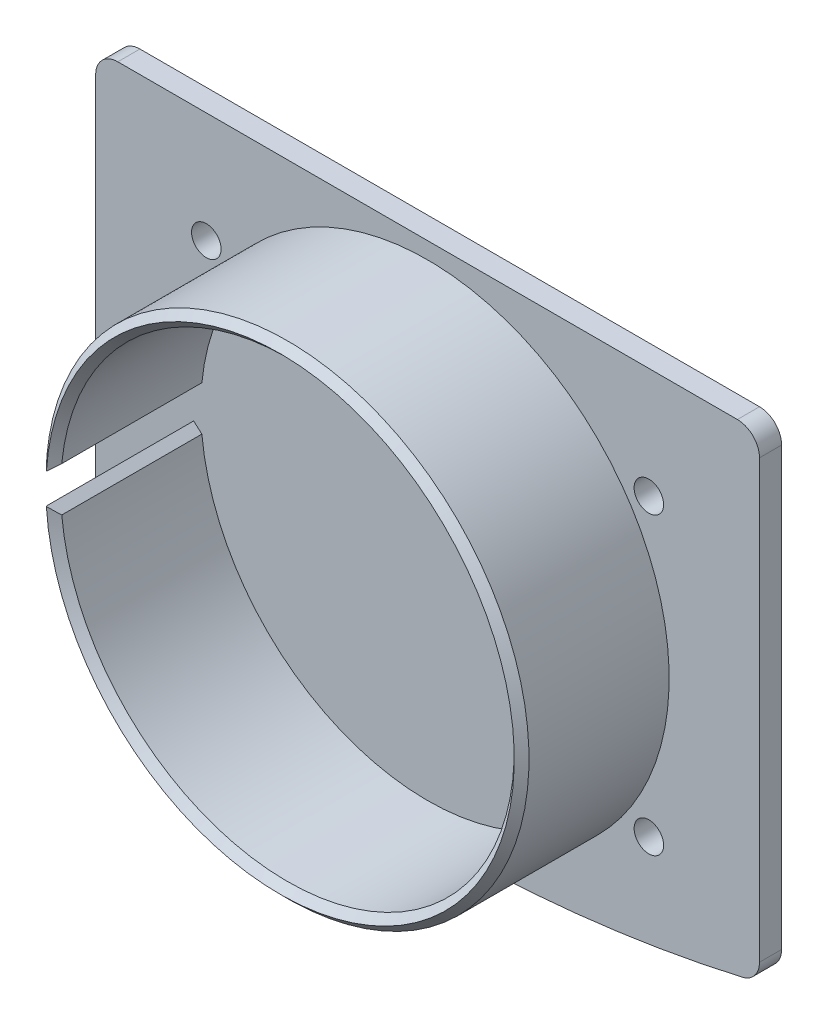
ISO-10303-21;
HEADER;
FILE_DESCRIPTION(('STEP AP214'),'2;1');
FILE_NAME('part.step','',(''),(''),'','','');
FILE_SCHEMA(('AUTOMOTIVE_DESIGN { 1 0 10303 214 1 1 1 1 }'));
ENDSEC;
DATA;
#1=APPLICATION_CONTEXT('core data for automotive mechanical design processes');
#2=APPLICATION_PROTOCOL_DEFINITION('international standard','automotive_design',2000,#1);
#3=PRODUCT_CONTEXT('',#1,'mechanical');
#4=PRODUCT('Part','Part','',(#3));
#5=PRODUCT_RELATED_PRODUCT_CATEGORY('part','',(#4));
#6=PRODUCT_DEFINITION_FORMATION('','',#4);
#7=PRODUCT_DEFINITION_CONTEXT('part definition',#1,'design');
#8=PRODUCT_DEFINITION('design','',#6,#7);
#9=PRODUCT_DEFINITION_SHAPE('','',#8);
#10=(LENGTH_UNIT() NAMED_UNIT(*) SI_UNIT(.MILLI.,.METRE.));
#11=(NAMED_UNIT(*) PLANE_ANGLE_UNIT() SI_UNIT($,.RADIAN.));
#12=(NAMED_UNIT(*) SI_UNIT($,.STERADIAN.) SOLID_ANGLE_UNIT());
#13=UNCERTAINTY_MEASURE_WITH_UNIT(LENGTH_MEASURE(1.E-05),#10,'distance_accuracy_value','');
#14=(GEOMETRIC_REPRESENTATION_CONTEXT(3) GLOBAL_UNCERTAINTY_ASSIGNED_CONTEXT((#13)) GLOBAL_UNIT_ASSIGNED_CONTEXT((#10,
#11,#12)) REPRESENTATION_CONTEXT('',''));
#15=CARTESIAN_POINT('',(0.,0.,0.));
#16=DIRECTION('',(0.,0.,1.));
#17=DIRECTION('',(1.,0.,0.));
#18=AXIS2_PLACEMENT_3D('',#15,#16,#17);
#19=CARTESIAN_POINT('',(0.,0.,3.));
#20=DIRECTION('',(0.,0.,1.));
#21=DIRECTION('',(1.,0.,0.));
#22=AXIS2_PLACEMENT_3D('',#19,#20,#21);
#23=PLANE('',#22);
#24=CARTESIAN_POINT('',(0.,0.,3.));
#25=DIRECTION('',(0.,0.,1.));
#26=DIRECTION('',(1.,0.,0.));
#27=AXIS2_PLACEMENT_3D('',#24,#25,#26);
#28=CIRCLE('',#27,30.75);
#29=CARTESIAN_POINT('',(-30.6019754080973,3.01356949848603,3.));
#30=VERTEX_POINT('',#29);
#31=CARTESIAN_POINT('',(-30.6019754080973,-3.01356949848603,3.));
#32=VERTEX_POINT('',#31);
#33=EDGE_CURVE('E187',#30,#32,#28,.F.);
#34=ORIENTED_EDGE('',*,*,#33,.F.);
#35=DIRECTION('',(-0.751600249018347,-0.659618879107897,0.));
#36=VECTOR('',#35,1.);
#37=CARTESIAN_POINT('',(-31.756883358109,2.,3.));
#38=LINE('',#37,#36);
#39=CARTESIAN_POINT('',(-31.720662435012,2.03178818091758,3.));
#40=VERTEX_POINT('',#39);
#41=EDGE_CURVE('E309',#30,#40,#38,.T.);
#42=ORIENTED_EDGE('',*,*,#41,.T.);
#43=DIRECTION('',(-0.707106781186551,0.707106781186544,0.));
#44=VECTOR('',#43,1.);
#45=CARTESIAN_POINT('',(-32.6186863764851,2.92981212239062,3.));
#46=LINE('',#45,#44);
#47=CARTESIAN_POINT('',(-32.6186863764851,2.92981212239062,3.));
#48=VERTEX_POINT('',#47);
#49=EDGE_CURVE('E304',#40,#48,#46,.T.);
#50=ORIENTED_EDGE('',*,*,#49,.T.);
#51=CARTESIAN_POINT('',(0.,0.,3.));
#52=DIRECTION('',(0.,0.,1.));
#53=DIRECTION('',(1.,0.,0.));
#54=AXIS2_PLACEMENT_3D('',#51,#52,#53);
#55=CIRCLE('',#54,32.75);
#56=CARTESIAN_POINT('',(-32.6186863764851,-2.92981212239062,3.));
#57=VERTEX_POINT('',#56);
#58=EDGE_CURVE('E178',#57,#48,#55,.T.);
#59=ORIENTED_EDGE('',*,*,#58,.F.);
#60=DIRECTION('',(-0.707106781186552,-0.707106781186543,0.));
#61=VECTOR('',#60,1.);
#62=CARTESIAN_POINT('',(-32.6186863764851,-2.92981212239062,3.));
#63=LINE('',#62,#61);
#64=CARTESIAN_POINT('',(-31.720662435012,-2.03178818091758,3.));
#65=VERTEX_POINT('',#64);
#66=EDGE_CURVE('E299',#57,#65,#63,.F.);
#67=ORIENTED_EDGE('',*,*,#66,.T.);
#68=DIRECTION('',(-0.751600249018349,0.659618879107895,0.));
#69=VECTOR('',#68,1.);
#70=CARTESIAN_POINT('',(-31.756883358109,-2.,3.));
#71=LINE('',#70,#69);
#72=EDGE_CURVE('E301',#65,#32,#71,.F.);
#73=ORIENTED_EDGE('',*,*,#72,.T.);
#74=EDGE_LOOP('',(#34,#42,#50,#59,#67,#73));
#75=FACE_BOUND('',#74,.T.);
#76=CARTESIAN_POINT('',(30.,20.,3.));
#77=DIRECTION('',(0.,0.,1.));
#78=DIRECTION('',(1.,0.,0.));
#79=AXIS2_PLACEMENT_3D('',#76,#77,#78);
#80=CIRCLE('',#79,2.);
#81=CARTESIAN_POINT('',(32.,20.,3.));
#82=VERTEX_POINT('',#81);
#83=EDGE_CURVE('E424',#82,#82,#80,.T.);
#84=ORIENTED_EDGE('',*,*,#83,.F.);
#85=EDGE_LOOP('',(#84));
#86=FACE_BOUND('',#85,.T.);
#87=CARTESIAN_POINT('',(30.,-20.,3.));
#88=DIRECTION('',(0.,0.,1.));
#89=DIRECTION('',(1.,0.,0.));
#90=AXIS2_PLACEMENT_3D('',#87,#88,#89);
#91=CIRCLE('',#90,2.);
#92=CARTESIAN_POINT('',(32.,-20.,3.));
#93=VERTEX_POINT('',#92);
#94=EDGE_CURVE('E432',#93,#93,#91,.T.);
#95=ORIENTED_EDGE('',*,*,#94,.F.);
#96=EDGE_LOOP('',(#95));
#97=FACE_BOUND('',#96,.T.);
#98=CARTESIAN_POINT('',(-30.,-20.,3.));
#99=DIRECTION('',(0.,0.,1.));
#100=DIRECTION('',(1.,0.,0.));
#101=AXIS2_PLACEMENT_3D('',#98,#99,#100);
#102=CIRCLE('',#101,2.);
#103=CARTESIAN_POINT('',(-28.,-20.,3.));
#104=VERTEX_POINT('',#103);
#105=EDGE_CURVE('E418',#104,#104,#102,.T.);
#106=ORIENTED_EDGE('',*,*,#105,.F.);
#107=EDGE_LOOP('',(#106));
#108=FACE_BOUND('',#107,.T.);
#109=CARTESIAN_POINT('',(-30.,20.,3.));
#110=DIRECTION('',(0.,0.,1.));
#111=DIRECTION('',(1.,0.,0.));
#112=AXIS2_PLACEMENT_3D('',#109,#110,#111);
#113=CIRCLE('',#112,2.);
#114=CARTESIAN_POINT('',(-28.,20.,3.));
#115=VERTEX_POINT('',#114);
#116=EDGE_CURVE('E405',#115,#115,#113,.T.);
#117=ORIENTED_EDGE('',*,*,#116,.F.);
#118=EDGE_LOOP('',(#117));
#119=FACE_BOUND('',#118,.T.);
#120=CARTESIAN_POINT('',(0.,155.,3.));
#121=DIRECTION('',(0.,0.,1.));
#122=DIRECTION('',(1.,0.,0.));
#123=AXIS2_PLACEMENT_3D('',#120,#121,#122);
#124=CIRCLE('',#123,190.);
#125=CARTESIAN_POINT('',(42.6737967914438,-30.1457454747545,3.));
#126=VERTEX_POINT('',#125);
#127=CARTESIAN_POINT('',(-42.6737967914438,-30.1457454747545,3.));
#128=VERTEX_POINT('',#127);
#129=EDGE_CURVE('E318',#126,#128,#124,.F.);
#130=ORIENTED_EDGE('',*,*,#129,.F.);
#131=CARTESIAN_POINT('',(42.,-27.2223915988374,3.));
#132=DIRECTION('',(0.,0.,1.));
#133=DIRECTION('',(1.,0.,0.));
#134=AXIS2_PLACEMENT_3D('',#131,#132,#133);
#135=CIRCLE('',#134,3.);
#136=CARTESIAN_POINT('',(45.,-27.2223915988374,3.));
#137=VERTEX_POINT('',#136);
#138=EDGE_CURVE('E57',#126,#137,#135,.T.);
#139=ORIENTED_EDGE('',*,*,#138,.T.);
#140=DIRECTION('',(0.,1.,0.));
#141=VECTOR('',#140,1.);
#142=CARTESIAN_POINT('',(45.,35.,3.));
#143=LINE('',#142,#141);
#144=CARTESIAN_POINT('',(45.,32.,3.));
#145=VERTEX_POINT('',#144);
#146=EDGE_CURVE('E370',#137,#145,#143,.T.);
#147=ORIENTED_EDGE('',*,*,#146,.T.);
#148=CARTESIAN_POINT('',(42.,32.,3.));
#149=DIRECTION('',(0.,0.,1.));
#150=DIRECTION('',(1.,0.,0.));
#151=AXIS2_PLACEMENT_3D('',#148,#149,#150);
#152=CIRCLE('',#151,3.);
#153=CARTESIAN_POINT('',(42.,35.,3.));
#154=VERTEX_POINT('',#153);
#155=EDGE_CURVE('E339',#145,#154,#152,.T.);
#156=ORIENTED_EDGE('',*,*,#155,.T.);
#157=DIRECTION('',(-1.,0.,0.));
#158=VECTOR('',#157,1.);
#159=CARTESIAN_POINT('',(-45.,35.,3.));
#160=LINE('',#159,#158);
#161=CARTESIAN_POINT('',(-42.,35.,3.));
#162=VERTEX_POINT('',#161);
#163=EDGE_CURVE('E194',#154,#162,#160,.T.);
#164=ORIENTED_EDGE('',*,*,#163,.T.);
#165=CARTESIAN_POINT('',(-42.,32.,3.));
#166=DIRECTION('',(0.,0.,1.));
#167=DIRECTION('',(1.,0.,0.));
#168=AXIS2_PLACEMENT_3D('',#165,#166,#167);
#169=CIRCLE('',#168,3.);
#170=CARTESIAN_POINT('',(-45.,32.,3.));
#171=VERTEX_POINT('',#170);
#172=EDGE_CURVE('E336',#162,#171,#169,.T.);
#173=ORIENTED_EDGE('',*,*,#172,.T.);
#174=DIRECTION('',(0.,-1.,0.));
#175=VECTOR('',#174,1.);
#176=CARTESIAN_POINT('',(-45.,35.,3.));
#177=LINE('',#176,#175);
#178=CARTESIAN_POINT('',(-45.,-27.2223915988373,3.));
#179=VERTEX_POINT('',#178);
#180=EDGE_CURVE('E380',#171,#179,#177,.T.);
#181=ORIENTED_EDGE('',*,*,#180,.T.);
#182=CARTESIAN_POINT('',(-42.,-27.2223915988373,3.));
#183=DIRECTION('',(0.,0.,1.));
#184=DIRECTION('',(1.,0.,0.));
#185=AXIS2_PLACEMENT_3D('',#182,#183,#184);
#186=CIRCLE('',#185,3.);
#187=EDGE_CURVE('E64',#179,#128,#186,.T.);
#188=ORIENTED_EDGE('',*,*,#187,.T.);
#189=EDGE_LOOP('',(#130,#139,#147,#156,#164,#173,#181,#188));
#190=FACE_BOUND('',#189,.T.);
#191=ADVANCED_FACE('F48',(#75,#86,#97,#108,#119,#190),#23,.T.);
#192=CARTESIAN_POINT('',(0.,0.,0.));
#193=DIRECTION('',(0.,0.,1.));
#194=DIRECTION('',(1.,0.,0.));
#195=AXIS2_PLACEMENT_3D('',#192,#193,#194);
#196=PLANE('',#195);
#197=CARTESIAN_POINT('',(30.,20.,0.));
#198=DIRECTION('',(0.,0.,1.));
#199=DIRECTION('',(1.,0.,0.));
#200=AXIS2_PLACEMENT_3D('',#197,#198,#199);
#201=CIRCLE('',#200,2.);
#202=CARTESIAN_POINT('',(32.,20.,0.));
#203=VERTEX_POINT('',#202);
#204=EDGE_CURVE('E420',#203,#203,#201,.T.);
#205=ORIENTED_EDGE('',*,*,#204,.T.);
#206=EDGE_LOOP('',(#205));
#207=FACE_BOUND('',#206,.T.);
#208=CARTESIAN_POINT('',(30.,-20.,0.));
#209=DIRECTION('',(0.,0.,1.));
#210=DIRECTION('',(1.,0.,0.));
#211=AXIS2_PLACEMENT_3D('',#208,#209,#210);
#212=CIRCLE('',#211,2.);
#213=CARTESIAN_POINT('',(32.,-20.,0.));
#214=VERTEX_POINT('',#213);
#215=EDGE_CURVE('E428',#214,#214,#212,.T.);
#216=ORIENTED_EDGE('',*,*,#215,.T.);
#217=EDGE_LOOP('',(#216));
#218=FACE_BOUND('',#217,.T.);
#219=CARTESIAN_POINT('',(-30.,-20.,0.));
#220=DIRECTION('',(0.,0.,1.));
#221=DIRECTION('',(1.,0.,0.));
#222=AXIS2_PLACEMENT_3D('',#219,#220,#221);
#223=CIRCLE('',#222,2.);
#224=CARTESIAN_POINT('',(-28.,-20.,0.));
#225=VERTEX_POINT('',#224);
#226=EDGE_CURVE('E436',#225,#225,#223,.T.);
#227=ORIENTED_EDGE('',*,*,#226,.T.);
#228=EDGE_LOOP('',(#227));
#229=FACE_BOUND('',#228,.T.);
#230=CARTESIAN_POINT('',(-30.,20.,0.));
#231=DIRECTION('',(0.,0.,1.));
#232=DIRECTION('',(1.,0.,0.));
#233=AXIS2_PLACEMENT_3D('',#230,#231,#232);
#234=CIRCLE('',#233,2.);
#235=CARTESIAN_POINT('',(-28.,20.,0.));
#236=VERTEX_POINT('',#235);
#237=EDGE_CURVE('E398',#236,#236,#234,.T.);
#238=ORIENTED_EDGE('',*,*,#237,.T.);
#239=EDGE_LOOP('',(#238));
#240=FACE_BOUND('',#239,.T.);
#241=DIRECTION('',(0.,1.,0.));
#242=VECTOR('',#241,1.);
#243=CARTESIAN_POINT('',(45.,35.,0.));
#244=LINE('',#243,#242);
#245=CARTESIAN_POINT('',(45.,-27.2223915988374,0.));
#246=VERTEX_POINT('',#245);
#247=CARTESIAN_POINT('',(45.,32.,0.));
#248=VERTEX_POINT('',#247);
#249=EDGE_CURVE('E387',#246,#248,#244,.T.);
#250=ORIENTED_EDGE('',*,*,#249,.F.);
#251=CARTESIAN_POINT('',(42.,-27.2223915988374,0.));
#252=DIRECTION('',(0.,0.,1.));
#253=DIRECTION('',(1.,0.,0.));
#254=AXIS2_PLACEMENT_3D('',#251,#252,#253);
#255=CIRCLE('',#254,3.);
#256=CARTESIAN_POINT('',(42.6737967914438,-30.1457454747545,0.));
#257=VERTEX_POINT('',#256);
#258=EDGE_CURVE('E357',#246,#257,#255,.F.);
#259=ORIENTED_EDGE('',*,*,#258,.T.);
#260=CARTESIAN_POINT('',(0.,155.,0.));
#261=DIRECTION('',(0.,0.,1.));
#262=DIRECTION('',(1.,0.,0.));
#263=AXIS2_PLACEMENT_3D('',#260,#261,#262);
#264=CIRCLE('',#263,190.);
#265=CARTESIAN_POINT('',(-42.6737967914438,-30.1457454747545,0.));
#266=VERTEX_POINT('',#265);
#267=EDGE_CURVE('E346',#257,#266,#264,.F.);
#268=ORIENTED_EDGE('',*,*,#267,.T.);
#269=CARTESIAN_POINT('',(-42.,-27.2223915988373,0.));
#270=DIRECTION('',(0.,0.,1.));
#271=DIRECTION('',(1.,0.,0.));
#272=AXIS2_PLACEMENT_3D('',#269,#270,#271);
#273=CIRCLE('',#272,3.);
#274=CARTESIAN_POINT('',(-45.,-27.2223915988373,0.));
#275=VERTEX_POINT('',#274);
#276=EDGE_CURVE('E354',#266,#275,#273,.F.);
#277=ORIENTED_EDGE('',*,*,#276,.T.);
#278=DIRECTION('',(0.,-1.,0.));
#279=VECTOR('',#278,1.);
#280=CARTESIAN_POINT('',(-45.,35.,0.));
#281=LINE('',#280,#279);
#282=CARTESIAN_POINT('',(-45.,32.,0.));
#283=VERTEX_POINT('',#282);
#284=EDGE_CURVE('E392',#283,#275,#281,.T.);
#285=ORIENTED_EDGE('',*,*,#284,.F.);
#286=CARTESIAN_POINT('',(-42.,32.,0.));
#287=DIRECTION('',(0.,0.,1.));
#288=DIRECTION('',(1.,0.,0.));
#289=AXIS2_PLACEMENT_3D('',#286,#287,#288);
#290=CIRCLE('',#289,3.);
#291=CARTESIAN_POINT('',(-42.,35.,0.));
#292=VERTEX_POINT('',#291);
#293=EDGE_CURVE('E325',#283,#292,#290,.F.);
#294=ORIENTED_EDGE('',*,*,#293,.T.);
#295=DIRECTION('',(-1.,0.,0.));
#296=VECTOR('',#295,1.);
#297=CARTESIAN_POINT('',(-45.,35.,0.));
#298=LINE('',#297,#296);
#299=CARTESIAN_POINT('',(42.,35.,0.));
#300=VERTEX_POINT('',#299);
#301=EDGE_CURVE('E402',#300,#292,#298,.T.);
#302=ORIENTED_EDGE('',*,*,#301,.F.);
#303=CARTESIAN_POINT('',(42.,32.,0.));
#304=DIRECTION('',(0.,0.,1.));
#305=DIRECTION('',(1.,0.,0.));
#306=AXIS2_PLACEMENT_3D('',#303,#304,#305);
#307=CIRCLE('',#306,3.);
#308=EDGE_CURVE('E328',#300,#248,#307,.F.);
#309=ORIENTED_EDGE('',*,*,#308,.T.);
#310=EDGE_LOOP('',(#250,#259,#268,#277,#285,#294,#302,#309));
#311=FACE_BOUND('',#310,.T.);
#312=ADVANCED_FACE('F385',(#207,#218,#229,#240,#311),#196,.F.);
#313=CARTESIAN_POINT('',(-45.,35.,3.));
#314=DIRECTION('',(1.,0.,0.));
#315=DIRECTION('',(0.,1.,0.));
#316=AXIS2_PLACEMENT_3D('',#313,#314,#315);
#317=PLANE('',#316);
#318=ORIENTED_EDGE('',*,*,#284,.T.);
#319=DIRECTION('',(0.,0.,-1.));
#320=VECTOR('',#319,1.);
#321=CARTESIAN_POINT('',(-45.,-27.2223915988373,3.));
#322=LINE('',#321,#320);
#323=EDGE_CURVE('E12',#275,#179,#322,.F.);
#324=ORIENTED_EDGE('',*,*,#323,.T.);
#325=ORIENTED_EDGE('',*,*,#180,.F.);
#326=DIRECTION('',(0.,0.,-1.));
#327=VECTOR('',#326,1.);
#328=CARTESIAN_POINT('',(-45.,32.,3.));
#329=LINE('',#328,#327);
#330=EDGE_CURVE('E342',#171,#283,#329,.T.);
#331=ORIENTED_EDGE('',*,*,#330,.T.);
#332=EDGE_LOOP('',(#318,#324,#325,#331));
#333=FACE_BOUND('',#332,.T.);
#334=ADVANCED_FACE('F394',(#333),#317,.F.);
#335=CARTESIAN_POINT('',(45.,35.,3.));
#336=DIRECTION('',(-1.,0.,0.));
#337=DIRECTION('',(0.,-1.,0.));
#338=AXIS2_PLACEMENT_3D('',#335,#336,#337);
#339=PLANE('',#338);
#340=ORIENTED_EDGE('',*,*,#146,.F.);
#341=DIRECTION('',(0.,0.,-1.));
#342=VECTOR('',#341,1.);
#343=CARTESIAN_POINT('',(45.,-27.2223915988374,3.));
#344=LINE('',#343,#342);
#345=EDGE_CURVE('E350',#137,#246,#344,.T.);
#346=ORIENTED_EDGE('',*,*,#345,.T.);
#347=ORIENTED_EDGE('',*,*,#249,.T.);
#348=DIRECTION('',(0.,0.,-1.));
#349=VECTOR('',#348,1.);
#350=CARTESIAN_POINT('',(45.,32.,3.));
#351=LINE('',#350,#349);
#352=EDGE_CURVE('E332',#248,#145,#351,.F.);
#353=ORIENTED_EDGE('',*,*,#352,.T.);
#354=EDGE_LOOP('',(#340,#346,#347,#353));
#355=FACE_BOUND('',#354,.T.);
#356=ADVANCED_FACE('F375',(#355),#339,.F.);
#357=CARTESIAN_POINT('',(-45.,35.,3.));
#358=DIRECTION('',(0.,-1.,0.));
#359=DIRECTION('',(0.,0.,-1.));
#360=AXIS2_PLACEMENT_3D('',#357,#358,#359);
#361=PLANE('',#360);
#362=ORIENTED_EDGE('',*,*,#163,.F.);
#363=DIRECTION('',(0.,0.,-1.));
#364=VECTOR('',#363,1.);
#365=CARTESIAN_POINT('',(42.,35.,3.));
#366=LINE('',#365,#364);
#367=EDGE_CURVE('E321',#154,#300,#366,.T.);
#368=ORIENTED_EDGE('',*,*,#367,.T.);
#369=ORIENTED_EDGE('',*,*,#301,.T.);
#370=DIRECTION('',(0.,0.,-1.));
#371=VECTOR('',#370,1.);
#372=CARTESIAN_POINT('',(-42.,35.,3.));
#373=LINE('',#372,#371);
#374=EDGE_CURVE('E312',#292,#162,#373,.F.);
#375=ORIENTED_EDGE('',*,*,#374,.T.);
#376=EDGE_LOOP('',(#362,#368,#369,#375));
#377=FACE_BOUND('',#376,.T.);
#378=ADVANCED_FACE('F457',(#377),#361,.F.);
#379=CARTESIAN_POINT('',(-30.,20.,0.));
#380=DIRECTION('',(0.,0.,1.));
#381=DIRECTION('',(1.,0.,0.));
#382=AXIS2_PLACEMENT_3D('',#379,#380,#381);
#383=CYLINDRICAL_SURFACE('',#382,2.);
#384=ORIENTED_EDGE('',*,*,#237,.F.);
#385=EDGE_LOOP('',(#384));
#386=FACE_BOUND('',#385,.T.);
#387=ORIENTED_EDGE('',*,*,#116,.T.);
#388=EDGE_LOOP('',(#387));
#389=FACE_BOUND('',#388,.T.);
#390=ADVANCED_FACE('F455',(#386,#389),#383,.F.);
#391=CARTESIAN_POINT('',(-30.,-20.,0.));
#392=DIRECTION('',(0.,0.,1.));
#393=DIRECTION('',(1.,0.,0.));
#394=AXIS2_PLACEMENT_3D('',#391,#392,#393);
#395=CYLINDRICAL_SURFACE('',#394,2.);
#396=ORIENTED_EDGE('',*,*,#226,.F.);
#397=EDGE_LOOP('',(#396));
#398=FACE_BOUND('',#397,.T.);
#399=ORIENTED_EDGE('',*,*,#105,.T.);
#400=EDGE_LOOP('',(#399));
#401=FACE_BOUND('',#400,.T.);
#402=ADVANCED_FACE('F448',(#398,#401),#395,.F.);
#403=CARTESIAN_POINT('',(30.,-20.,0.));
#404=DIRECTION('',(0.,0.,1.));
#405=DIRECTION('',(1.,0.,0.));
#406=AXIS2_PLACEMENT_3D('',#403,#404,#405);
#407=CYLINDRICAL_SURFACE('',#406,2.);
#408=ORIENTED_EDGE('',*,*,#215,.F.);
#409=EDGE_LOOP('',(#408));
#410=FACE_BOUND('',#409,.T.);
#411=ORIENTED_EDGE('',*,*,#94,.T.);
#412=EDGE_LOOP('',(#411));
#413=FACE_BOUND('',#412,.T.);
#414=ADVANCED_FACE('F463',(#410,#413),#407,.F.);
#415=CARTESIAN_POINT('',(30.,20.,0.));
#416=DIRECTION('',(0.,0.,1.));
#417=DIRECTION('',(1.,0.,0.));
#418=AXIS2_PLACEMENT_3D('',#415,#416,#417);
#419=CYLINDRICAL_SURFACE('',#418,2.);
#420=ORIENTED_EDGE('',*,*,#204,.F.);
#421=EDGE_LOOP('',(#420));
#422=FACE_BOUND('',#421,.T.);
#423=ORIENTED_EDGE('',*,*,#83,.T.);
#424=EDGE_LOOP('',(#423));
#425=FACE_BOUND('',#424,.T.);
#426=ADVANCED_FACE('F470',(#422,#425),#419,.F.);
#427=CARTESIAN_POINT('',(0.,0.,23.));
#428=DIRECTION('',(0.,0.,-1.));
#429=DIRECTION('',(-1.,0.,0.));
#430=AXIS2_PLACEMENT_3D('',#427,#428,#429);
#431=CYLINDRICAL_SURFACE('',#430,32.75);
#432=CARTESIAN_POINT('',(0.,0.,22.));
#433=DIRECTION('',(0.,0.,1.));
#434=DIRECTION('',(1.,0.,0.));
#435=AXIS2_PLACEMENT_3D('',#432,#433,#434);
#436=CIRCLE('',#435,32.75);
#437=CARTESIAN_POINT('',(-32.6186863764851,2.92981212239062,22.));
#438=VERTEX_POINT('',#437);
#439=CARTESIAN_POINT('',(-32.6186863764851,-2.92981212239062,22.));
#440=VERTEX_POINT('',#439);
#441=EDGE_CURVE('E175',#438,#440,#436,.F.);
#442=ORIENTED_EDGE('',*,*,#441,.T.);
#443=DIRECTION('',(0.,0.,-1.));
#444=VECTOR('',#443,1.);
#445=CARTESIAN_POINT('',(-32.6186863764851,-2.92981212239062,23.));
#446=LINE('',#445,#444);
#447=EDGE_CURVE('E180',#440,#57,#446,.T.);
#448=ORIENTED_EDGE('',*,*,#447,.T.);
#449=ORIENTED_EDGE('',*,*,#58,.T.);
#450=DIRECTION('',(0.,0.,-1.));
#451=VECTOR('',#450,1.);
#452=CARTESIAN_POINT('',(-32.6186863764851,2.92981212239062,23.));
#453=LINE('',#452,#451);
#454=EDGE_CURVE('E160',#48,#438,#453,.F.);
#455=ORIENTED_EDGE('',*,*,#454,.T.);
#456=EDGE_LOOP('',(#442,#448,#449,#455));
#457=FACE_BOUND('',#456,.T.);
#458=ADVANCED_FACE('F173',(#457),#431,.T.);
#459=CARTESIAN_POINT('',(0.,0.,23.));
#460=DIRECTION('',(0.,0.,-1.));
#461=DIRECTION('',(-1.,0.,0.));
#462=AXIS2_PLACEMENT_3D('',#459,#460,#461);
#463=CYLINDRICAL_SURFACE('',#462,30.75);
#464=ORIENTED_EDGE('',*,*,#33,.T.);
#465=DIRECTION('',(0.,0.,-1.));
#466=VECTOR('',#465,1.);
#467=CARTESIAN_POINT('',(-30.6019754080974,-3.01356949848603,23.));
#468=LINE('',#467,#466);
#469=CARTESIAN_POINT('',(-30.6019754080973,-3.01356949848603,22.));
#470=VERTEX_POINT('',#469);
#471=EDGE_CURVE('E248',#32,#470,#468,.F.);
#472=ORIENTED_EDGE('',*,*,#471,.T.);
#473=CARTESIAN_POINT('',(0.,0.,22.));
#474=DIRECTION('',(0.,0.,1.));
#475=DIRECTION('',(1.,0.,0.));
#476=AXIS2_PLACEMENT_3D('',#473,#474,#475);
#477=CIRCLE('',#476,30.75);
#478=CARTESIAN_POINT('',(-30.6019754080973,3.01356949848603,22.));
#479=VERTEX_POINT('',#478);
#480=EDGE_CURVE('E181',#470,#479,#477,.T.);
#481=ORIENTED_EDGE('',*,*,#480,.T.);
#482=DIRECTION('',(0.,0.,-1.));
#483=VECTOR('',#482,1.);
#484=CARTESIAN_POINT('',(-30.6019754080974,3.01356949848603,23.));
#485=LINE('',#484,#483);
#486=EDGE_CURVE('E279',#479,#30,#485,.T.);
#487=ORIENTED_EDGE('',*,*,#486,.T.);
#488=EDGE_LOOP('',(#464,#472,#481,#487));
#489=FACE_BOUND('',#488,.T.);
#490=ADVANCED_FACE('F262',(#489),#463,.F.);
#491=CARTESIAN_POINT('',(0.,0.,22.));
#492=DIRECTION('',(0.,0.,1.));
#493=DIRECTION('',(1.,0.,0.));
#494=AXIS2_PLACEMENT_3D('',#491,#492,#493);
#495=CONICAL_SURFACE('',#494,30.75,0.785398163397459);
#496=ORIENTED_EDGE('',*,*,#480,.F.);
#497=CARTESIAN_POINT('',(-30.6019754080973,-3.01356949848603,22.));
#498=CARTESIAN_POINT('',(-30.6925532040343,-2.9340766772609,22.0823514553551));
#499=CARTESIAN_POINT('',(-30.7829988409855,-2.85469984131134,22.164960079331));
#500=CARTESIAN_POINT('',(-30.9636311557315,-2.69617343696403,22.3306729128602));
#501=CARTESIAN_POINT('',(-31.0538178376559,-2.61702386494205,22.4137771144446));
#502=CARTESIAN_POINT('',(-31.2339404363061,-2.45894479727431,22.5804649295655));
#503=CARTESIAN_POINT('',(-31.3238763532256,-2.38001530145858,22.6640485427316));
#504=CARTESIAN_POINT('',(-31.5035054663671,-2.22236932619406,22.8316802852238));
#505=CARTESIAN_POINT('',(-31.5931986586736,-2.14365285018167,22.9157284219778));
#506=CARTESIAN_POINT('',(-31.682773033814,-2.06504065040646,23.));
#507=B_SPLINE_CURVE_WITH_KNOTS('',3,(#497,#498,#499,#500,#501,#502,#503,#504,#505,#506),
.UNSPECIFIED.,.F.,.F.,(4,2,2,2,4),(0.,0.437888653288207,0.875770284243997,1.31365157691814,
1.75153989181219),.UNSPECIFIED.);
#508=CARTESIAN_POINT('',(-31.682773033814,-2.06504065040646,23.));
#509=VERTEX_POINT('',#508);
#510=EDGE_CURVE('E247',#470,#509,#507,.T.);
#511=ORIENTED_EDGE('',*,*,#510,.T.);
#512=CARTESIAN_POINT('',(0.,0.,23.));
#513=DIRECTION('',(0.,0.,1.));
#514=DIRECTION('',(1.,0.,0.));
#515=AXIS2_PLACEMENT_3D('',#512,#513,#514);
#516=CIRCLE('',#515,31.75);
#517=CARTESIAN_POINT('',(-31.682773033814,2.06504065040646,23.));
#518=VERTEX_POINT('',#517);
#519=EDGE_CURVE('E198',#518,#509,#516,.F.);
#520=ORIENTED_EDGE('',*,*,#519,.F.);
#521=CARTESIAN_POINT('',(-31.682773033814,2.06504065040646,23.));
#522=CARTESIAN_POINT('',(-31.5931986586736,2.14365285018166,22.9157284219778));
#523=CARTESIAN_POINT('',(-31.5035054663672,2.22236932619406,22.8316802852238));
#524=CARTESIAN_POINT('',(-31.3238763532256,2.38001530145858,22.6640485427316));
#525=CARTESIAN_POINT('',(-31.2339404363061,2.4589447972743,22.5804649295655));
#526=CARTESIAN_POINT('',(-31.0538178376559,2.61702386494204,22.4137771144446));
#527=CARTESIAN_POINT('',(-30.9636311557315,2.69617343696403,22.3306729128602));
#528=CARTESIAN_POINT('',(-30.7829988409855,2.85469984131134,22.164960079331));
#529=CARTESIAN_POINT('',(-30.6925532040343,2.9340766772609,22.0823514553551));
#530=CARTESIAN_POINT('',(-30.6019754080973,3.01356949848603,22.));
#531=B_SPLINE_CURVE_WITH_KNOTS('',3,(#521,#522,#523,#524,#525,#526,#527,#528,#529,#530),
.UNSPECIFIED.,.F.,.F.,(4,2,2,2,4),(0.,0.437888314894043,0.875769607568188,1.31365123852398,
1.75153989181219),.UNSPECIFIED.);
#532=EDGE_CURVE('E239',#518,#479,#531,.T.);
#533=ORIENTED_EDGE('',*,*,#532,.T.);
#534=EDGE_LOOP('',(#496,#511,#520,#533));
#535=FACE_BOUND('',#534,.T.);
#536=ADVANCED_FACE('F256',(#535),#495,.F.);
#537=CARTESIAN_POINT('',(0.,0.,23.));
#538=DIRECTION('',(0.,0.,-1.));
#539=DIRECTION('',(-1.,0.,0.));
#540=AXIS2_PLACEMENT_3D('',#537,#538,#539);
#541=CONICAL_SURFACE('',#540,31.75,0.785398163397445);
#542=CARTESIAN_POINT('',(-31.682773033814,-2.06504065040646,23.));
#543=CARTESIAN_POINT('',(-31.6951292620471,-2.05419658612131,22.9883752210266));
#544=CARTESIAN_POINT('',(-31.707483236522,-2.0433544997778,22.9767462060153));
#545=CARTESIAN_POINT('',(-31.7321866779536,-2.02167428297564,22.9534797039184));
#546=CARTESIAN_POINT('',(-31.7445361449104,-2.010836152517,22.9418422168328));
#547=CARTESIAN_POINT('',(-31.756883358109,-2.,22.9302004937092));
#548=B_SPLINE_CURVE_WITH_KNOTS('',3,(#542,#543,#544,#545,#546,#547),.UNSPECIFIED.,.F.,.F.,(4,2,
4),(0.,0.0604040528910476,0.120808105773281),.UNSPECIFIED.);
#549=CARTESIAN_POINT('',(-31.720662435012,-2.03178818091758,22.9643335994336));
#550=VERTEX_POINT('',#549);
#551=EDGE_CURVE('E167',#509,#550,#548,.T.);
#552=ORIENTED_EDGE('',*,*,#551,.T.);
#553=CARTESIAN_POINT('',(-31.6888742540945,-2.,22.9980748380227));
#554=CARTESIAN_POINT('',(-31.8444878759371,-2.15561362184266,22.8329306284773));
#555=CARTESIAN_POINT('',(-31.9997790393649,-2.31090478527048,22.6671856107931));
#556=CARTESIAN_POINT('',(-32.3097164133451,-2.62084215925068,22.3344939978394));
#557=CARTESIAN_POINT('',(-32.4643626240475,-2.77548836995306,22.1675474028493));
#558=CARTESIAN_POINT('',(-32.6186863764851,-2.92981212239062,22.));
#559=B_SPLINE_CURVE_WITH_KNOTS('',3,(#553,#554,#555,#556,#557,#558),.UNSPECIFIED.,.F.,.F.,(4,2,
4),(0.,0.825420447942653,1.65084070389228),.UNSPECIFIED.);
#560=EDGE_CURVE('E185',#550,#440,#559,.T.);
#561=ORIENTED_EDGE('',*,*,#560,.T.);
#562=ORIENTED_EDGE('',*,*,#441,.F.);
#563=CARTESIAN_POINT('',(-32.6186863764851,2.92981212239062,22.));
#564=CARTESIAN_POINT('',(-32.4643626240475,2.77548836995307,22.1675474028493));
#565=CARTESIAN_POINT('',(-32.3097164133451,2.62084215925068,22.3344939978394));
#566=CARTESIAN_POINT('',(-31.9997790393649,2.31090478527048,22.6671856107931));
#567=CARTESIAN_POINT('',(-31.8444878759371,2.15561362184266,22.8329306284773));
#568=CARTESIAN_POINT('',(-31.6888742540945,2.,22.9980748380227));
#569=B_SPLINE_CURVE_WITH_KNOTS('',3,(#563,#564,#565,#566,#567,#568),.UNSPECIFIED.,.F.,.F.,(4,2,
4),(0.,0.825420255949621,1.65084070389228),.UNSPECIFIED.);
#570=CARTESIAN_POINT('',(-31.7206624349979,2.03178818092999,22.9643335994469));
#571=VERTEX_POINT('',#570);
#572=EDGE_CURVE('E156',#438,#571,#569,.T.);
#573=ORIENTED_EDGE('',*,*,#572,.T.);
#574=CARTESIAN_POINT('',(-31.756883358109,2.,22.9302004937164));
#575=CARTESIAN_POINT('',(-31.7445361449096,2.01083615251774,22.9418422168372));
#576=CARTESIAN_POINT('',(-31.7321866779524,2.02167428297675,22.9534797039208));
#577=CARTESIAN_POINT('',(-31.7074832365207,2.0433544997789,22.9767462060153));
#578=CARTESIAN_POINT('',(-31.6951292620462,2.05419658612205,22.9883752210262));
#579=CARTESIAN_POINT('',(-31.682773033814,2.06504065040646,23.));
#580=B_SPLINE_CURVE_WITH_KNOTS('',3,(#574,#575,#576,#577,#578,#579),.UNSPECIFIED.,.F.,.F.,(4,2,
4),(0.,0.0604040528801658,0.12080810576914),.UNSPECIFIED.);
#581=EDGE_CURVE('E168',#571,#518,#580,.T.);
#582=ORIENTED_EDGE('',*,*,#581,.T.);
#583=ORIENTED_EDGE('',*,*,#519,.T.);
#584=EDGE_LOOP('',(#552,#561,#562,#573,#582,#583));
#585=FACE_BOUND('',#584,.T.);
#586=ADVANCED_FACE('F183',(#585),#541,.T.);
#587=CARTESIAN_POINT('',(-31.756883358109,-2.,23.));
#588=DIRECTION('',(-0.659618879107895,-0.751600249018349,0.));
#589=DIRECTION('',(0.,0.,-1.));
#590=AXIS2_PLACEMENT_3D('',#587,#588,#589);
#591=PLANE('',#590);
#592=DIRECTION('',(0.,0.,1.));
#593=VECTOR('',#592,1.);
#594=CARTESIAN_POINT('',(-31.720662435012,-2.03178818091758,23.));
#595=LINE('',#594,#593);
#596=EDGE_CURVE('E201',#550,#65,#595,.F.);
#597=ORIENTED_EDGE('',*,*,#596,.F.);
#598=ORIENTED_EDGE('',*,*,#551,.F.);
#599=ORIENTED_EDGE('',*,*,#510,.F.);
#600=ORIENTED_EDGE('',*,*,#471,.F.);
#601=ORIENTED_EDGE('',*,*,#72,.F.);
#602=EDGE_LOOP('',(#597,#598,#599,#600,#601));
#603=FACE_BOUND('',#602,.T.);
#604=ADVANCED_FACE('F270',(#603),#591,.F.);
#605=CARTESIAN_POINT('',(-32.6186863764851,-2.92981212239062,23.));
#606=DIRECTION('',(0.707106781186543,-0.707106781186552,0.));
#607=DIRECTION('',(0.,0.,-1.));
#608=AXIS2_PLACEMENT_3D('',#605,#606,#607);
#609=PLANE('',#608);
#610=ORIENTED_EDGE('',*,*,#560,.F.);
#611=ORIENTED_EDGE('',*,*,#596,.T.);
#612=ORIENTED_EDGE('',*,*,#66,.F.);
#613=ORIENTED_EDGE('',*,*,#447,.F.);
#614=EDGE_LOOP('',(#610,#611,#612,#613));
#615=FACE_BOUND('',#614,.T.);
#616=ADVANCED_FACE('F231',(#615),#609,.F.);
#617=CARTESIAN_POINT('',(-31.756883358109,2.,23.));
#618=DIRECTION('',(0.659618879107897,-0.751600249018347,0.));
#619=DIRECTION('',(0.,0.,-1.));
#620=AXIS2_PLACEMENT_3D('',#617,#618,#619);
#621=PLANE('',#620);
#622=DIRECTION('',(0.,0.,-1.));
#623=VECTOR('',#622,1.);
#624=CARTESIAN_POINT('',(-31.720662435012,2.03178818091758,23.));
#625=LINE('',#624,#623);
#626=EDGE_CURVE('E162',#40,#571,#625,.F.);
#627=ORIENTED_EDGE('',*,*,#626,.F.);
#628=ORIENTED_EDGE('',*,*,#41,.F.);
#629=ORIENTED_EDGE('',*,*,#486,.F.);
#630=ORIENTED_EDGE('',*,*,#532,.F.);
#631=ORIENTED_EDGE('',*,*,#581,.F.);
#632=EDGE_LOOP('',(#627,#628,#629,#630,#631));
#633=FACE_BOUND('',#632,.T.);
#634=ADVANCED_FACE('F223',(#633),#621,.T.);
#635=CARTESIAN_POINT('',(-32.6186863764851,2.92981212239062,23.));
#636=DIRECTION('',(-0.707106781186544,-0.707106781186551,0.));
#637=DIRECTION('',(0.,0.,-1.));
#638=AXIS2_PLACEMENT_3D('',#635,#636,#637);
#639=PLANE('',#638);
#640=ORIENTED_EDGE('',*,*,#49,.F.);
#641=ORIENTED_EDGE('',*,*,#626,.T.);
#642=ORIENTED_EDGE('',*,*,#572,.F.);
#643=ORIENTED_EDGE('',*,*,#454,.F.);
#644=EDGE_LOOP('',(#640,#641,#642,#643));
#645=FACE_BOUND('',#644,.T.);
#646=ADVANCED_FACE('F159',(#645),#639,.T.);
#647=CARTESIAN_POINT('',(42.,32.,3.));
#648=DIRECTION('',(0.,0.,-1.));
#649=DIRECTION('',(-1.,0.,0.));
#650=AXIS2_PLACEMENT_3D('',#647,#648,#649);
#651=CYLINDRICAL_SURFACE('',#650,3.);
#652=ORIENTED_EDGE('',*,*,#155,.F.);
#653=ORIENTED_EDGE('',*,*,#352,.F.);
#654=ORIENTED_EDGE('',*,*,#308,.F.);
#655=ORIENTED_EDGE('',*,*,#367,.F.);
#656=EDGE_LOOP('',(#652,#653,#654,#655));
#657=FACE_BOUND('',#656,.T.);
#658=ADVANCED_FACE('F235',(#657),#651,.T.);
#659=CARTESIAN_POINT('',(-42.,32.,3.));
#660=DIRECTION('',(0.,0.,-1.));
#661=DIRECTION('',(-1.,0.,0.));
#662=AXIS2_PLACEMENT_3D('',#659,#660,#661);
#663=CYLINDRICAL_SURFACE('',#662,3.);
#664=ORIENTED_EDGE('',*,*,#172,.F.);
#665=ORIENTED_EDGE('',*,*,#374,.F.);
#666=ORIENTED_EDGE('',*,*,#293,.F.);
#667=ORIENTED_EDGE('',*,*,#330,.F.);
#668=EDGE_LOOP('',(#664,#665,#666,#667));
#669=FACE_BOUND('',#668,.T.);
#670=ADVANCED_FACE('F495',(#669),#663,.T.);
#671=CARTESIAN_POINT('',(0.,155.,23.));
#672=DIRECTION('',(0.,0.,-1.));
#673=DIRECTION('',(-1.,0.,0.));
#674=AXIS2_PLACEMENT_3D('',#671,#672,#673);
#675=CYLINDRICAL_SURFACE('',#674,190.);
#676=ORIENTED_EDGE('',*,*,#267,.F.);
#677=DIRECTION('',(0.,0.,-1.));
#678=VECTOR('',#677,1.);
#679=CARTESIAN_POINT('',(42.6737967914438,-30.1457454747545,23.));
#680=LINE('',#679,#678);
#681=EDGE_CURVE('E363',#257,#126,#680,.F.);
#682=ORIENTED_EDGE('',*,*,#681,.T.);
#683=ORIENTED_EDGE('',*,*,#129,.T.);
#684=DIRECTION('',(0.,0.,-1.));
#685=VECTOR('',#684,1.);
#686=CARTESIAN_POINT('',(-42.6737967914438,-30.1457454747545,23.));
#687=LINE('',#686,#685);
#688=EDGE_CURVE('E360',#128,#266,#687,.T.);
#689=ORIENTED_EDGE('',*,*,#688,.T.);
#690=EDGE_LOOP('',(#676,#682,#683,#689));
#691=FACE_BOUND('',#690,.T.);
#692=ADVANCED_FACE('F389',(#691),#675,.T.);
#693=CARTESIAN_POINT('',(42.,-27.2223915988374,23.));
#694=DIRECTION('',(0.,0.,-1.));
#695=DIRECTION('',(-1.,0.,0.));
#696=AXIS2_PLACEMENT_3D('',#693,#694,#695);
#697=CYLINDRICAL_SURFACE('',#696,3.);
#698=ORIENTED_EDGE('',*,*,#138,.F.);
#699=ORIENTED_EDGE('',*,*,#681,.F.);
#700=ORIENTED_EDGE('',*,*,#258,.F.);
#701=ORIENTED_EDGE('',*,*,#345,.F.);
#702=EDGE_LOOP('',(#698,#699,#700,#701));
#703=FACE_BOUND('',#702,.T.);
#704=ADVANCED_FACE('F382',(#703),#697,.T.);
#705=CARTESIAN_POINT('',(-42.,-27.2223915988373,23.));
#706=DIRECTION('',(0.,0.,-1.));
#707=DIRECTION('',(-1.,0.,0.));
#708=AXIS2_PLACEMENT_3D('',#705,#706,#707);
#709=CYLINDRICAL_SURFACE('',#708,3.);
#710=ORIENTED_EDGE('',*,*,#276,.F.);
#711=ORIENTED_EDGE('',*,*,#688,.F.);
#712=ORIENTED_EDGE('',*,*,#187,.F.);
#713=ORIENTED_EDGE('',*,*,#323,.F.);
#714=EDGE_LOOP('',(#710,#711,#712,#713));
#715=FACE_BOUND('',#714,.T.);
#716=ADVANCED_FACE('F50',(#715),#709,.T.);
#717=CLOSED_SHELL('',(#191,#312,#334,#356,#378,#390,#402,#414,#426,#458,#490,#536,#586,#604,
#616,#634,#646,#658,#670,#692,#704,#716));
#718=MANIFOLD_SOLID_BREP('B2',#717);
#719=ADVANCED_BREP_SHAPE_REPRESENTATION('',(#18,#718),#14);
#720=SHAPE_DEFINITION_REPRESENTATION(#9,#719);
ENDSEC;
END-ISO-10303-21;
